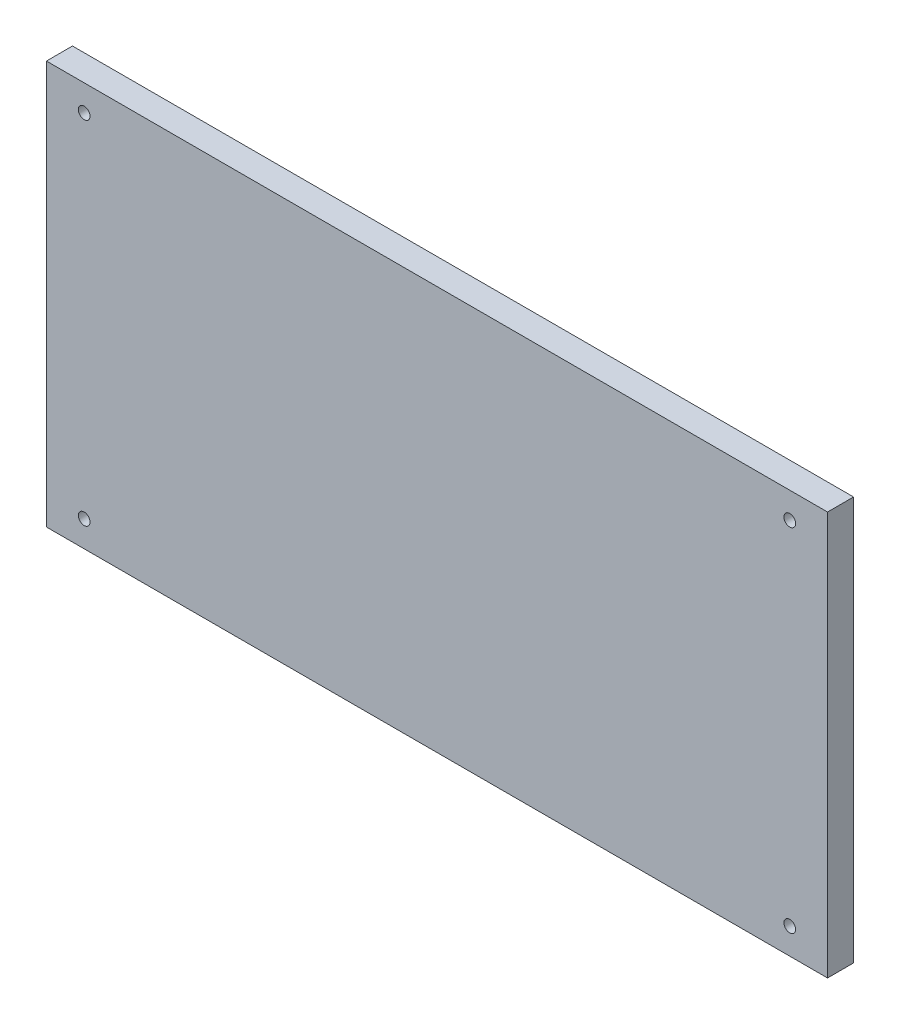
ISO-10303-21;
HEADER;
FILE_DESCRIPTION(('STEP AP214'),'2;1');
FILE_NAME('part.step','',(''),(''),'','','');
FILE_SCHEMA(('AUTOMOTIVE_DESIGN { 1 0 10303 214 1 1 1 1 }'));
ENDSEC;
DATA;
#1=APPLICATION_CONTEXT('core data for automotive mechanical design processes');
#2=APPLICATION_PROTOCOL_DEFINITION('international standard','automotive_design',2000,#1);
#3=PRODUCT_CONTEXT('',#1,'mechanical');
#4=PRODUCT('Part','Part','',(#3));
#5=PRODUCT_RELATED_PRODUCT_CATEGORY('part','',(#4));
#6=PRODUCT_DEFINITION_FORMATION('','',#4);
#7=PRODUCT_DEFINITION_CONTEXT('part definition',#1,'design');
#8=PRODUCT_DEFINITION('design','',#6,#7);
#9=PRODUCT_DEFINITION_SHAPE('','',#8);
#10=(LENGTH_UNIT() NAMED_UNIT(*) SI_UNIT(.MILLI.,.METRE.));
#11=(NAMED_UNIT(*) PLANE_ANGLE_UNIT() SI_UNIT($,.RADIAN.));
#12=(NAMED_UNIT(*) SI_UNIT($,.STERADIAN.) SOLID_ANGLE_UNIT());
#13=UNCERTAINTY_MEASURE_WITH_UNIT(LENGTH_MEASURE(1.E-05),#10,'distance_accuracy_value','');
#14=(GEOMETRIC_REPRESENTATION_CONTEXT(3) GLOBAL_UNCERTAINTY_ASSIGNED_CONTEXT((#13)) GLOBAL_UNIT_ASSIGNED_CONTEXT((#10,
#11,#12)) REPRESENTATION_CONTEXT('',''));
#15=CARTESIAN_POINT('',(0.,0.,0.));
#16=DIRECTION('',(0.,0.,1.));
#17=DIRECTION('',(1.,0.,0.));
#18=AXIS2_PLACEMENT_3D('',#15,#16,#17);
#19=CARTESIAN_POINT('',(-122.444571469039,41.9354838709677,10.));
#20=DIRECTION('',(1.,0.,0.));
#21=DIRECTION('',(0.,1.,0.));
#22=AXIS2_PLACEMENT_3D('',#19,#20,#21);
#23=PLANE('',#22);
#24=DIRECTION('',(0.,-1.,0.));
#25=VECTOR('',#24,1.);
#26=CARTESIAN_POINT('',(-122.444571469039,41.9354838709677,0.));
#27=LINE('',#26,#25);
#28=CARTESIAN_POINT('',(-122.444571469039,41.9354838709677,0.));
#29=VERTEX_POINT('',#28);
#30=CARTESIAN_POINT('',(-122.444571469039,-113.064516129032,0.));
#31=VERTEX_POINT('',#30);
#32=EDGE_CURVE('E106',#29,#31,#27,.T.);
#33=ORIENTED_EDGE('',*,*,#32,.T.);
#34=DIRECTION('',(0.,0.,-1.));
#35=VECTOR('',#34,1.);
#36=CARTESIAN_POINT('',(-122.444571469039,-113.064516129032,10.));
#37=LINE('',#36,#35);
#38=CARTESIAN_POINT('',(-122.444571469039,-113.064516129032,10.));
#39=VERTEX_POINT('',#38);
#40=EDGE_CURVE('E11',#39,#31,#37,.T.);
#41=ORIENTED_EDGE('',*,*,#40,.F.);
#42=DIRECTION('',(0.,-1.,0.));
#43=VECTOR('',#42,1.);
#44=CARTESIAN_POINT('',(-122.444571469039,41.9354838709677,10.));
#45=LINE('',#44,#43);
#46=CARTESIAN_POINT('',(-122.444571469039,41.9354838709677,10.));
#47=VERTEX_POINT('',#46);
#48=EDGE_CURVE('E90',#47,#39,#45,.T.);
#49=ORIENTED_EDGE('',*,*,#48,.F.);
#50=DIRECTION('',(0.,0.,-1.));
#51=VECTOR('',#50,1.);
#52=CARTESIAN_POINT('',(-122.444571469039,41.9354838709677,10.));
#53=LINE('',#52,#51);
#54=EDGE_CURVE('E102',#47,#29,#53,.T.);
#55=ORIENTED_EDGE('',*,*,#54,.T.);
#56=EDGE_LOOP('',(#33,#41,#49,#55));
#57=FACE_BOUND('',#56,.T.);
#58=ADVANCED_FACE('F38',(#57),#23,.F.);
#59=CARTESIAN_POINT('',(-122.444571469039,-113.064516129032,10.));
#60=DIRECTION('',(0.,1.,0.));
#61=DIRECTION('',(0.,0.,1.));
#62=AXIS2_PLACEMENT_3D('',#59,#60,#61);
#63=PLANE('',#62);
#64=DIRECTION('',(1.,0.,0.));
#65=VECTOR('',#64,1.);
#66=CARTESIAN_POINT('',(-122.444571469039,-113.064516129032,0.));
#67=LINE('',#66,#65);
#68=CARTESIAN_POINT('',(177.555428530961,-113.064516129032,0.));
#69=VERTEX_POINT('',#68);
#70=EDGE_CURVE('E95',#31,#69,#67,.T.);
#71=ORIENTED_EDGE('',*,*,#70,.T.);
#72=DIRECTION('',(0.,0.,-1.));
#73=VECTOR('',#72,1.);
#74=CARTESIAN_POINT('',(177.555428530961,-113.064516129032,10.));
#75=LINE('',#74,#73);
#76=CARTESIAN_POINT('',(177.555428530961,-113.064516129032,10.));
#77=VERTEX_POINT('',#76);
#78=EDGE_CURVE('E47',#77,#69,#75,.T.);
#79=ORIENTED_EDGE('',*,*,#78,.F.);
#80=DIRECTION('',(1.,0.,0.));
#81=VECTOR('',#80,1.);
#82=CARTESIAN_POINT('',(-122.444571469039,-113.064516129032,10.));
#83=LINE('',#82,#81);
#84=EDGE_CURVE('E85',#39,#77,#83,.T.);
#85=ORIENTED_EDGE('',*,*,#84,.F.);
#86=ORIENTED_EDGE('',*,*,#40,.T.);
#87=EDGE_LOOP('',(#71,#79,#85,#86));
#88=FACE_BOUND('',#87,.T.);
#89=ADVANCED_FACE('F94',(#88),#63,.F.);
#90=CARTESIAN_POINT('',(177.555428530961,41.9354838709677,10.));
#91=DIRECTION('',(-1.,0.,0.));
#92=DIRECTION('',(0.,-1.,0.));
#93=AXIS2_PLACEMENT_3D('',#90,#91,#92);
#94=PLANE('',#93);
#95=DIRECTION('',(0.,1.,0.));
#96=VECTOR('',#95,1.);
#97=CARTESIAN_POINT('',(177.555428530961,41.9354838709677,0.));
#98=LINE('',#97,#96);
#99=CARTESIAN_POINT('',(177.555428530961,41.9354838709677,0.));
#100=VERTEX_POINT('',#99);
#101=EDGE_CURVE('E72',#69,#100,#98,.T.);
#102=ORIENTED_EDGE('',*,*,#101,.T.);
#103=DIRECTION('',(0.,0.,-1.));
#104=VECTOR('',#103,1.);
#105=CARTESIAN_POINT('',(177.555428530961,41.9354838709677,10.));
#106=LINE('',#105,#104);
#107=CARTESIAN_POINT('',(177.555428530961,41.9354838709677,10.));
#108=VERTEX_POINT('',#107);
#109=EDGE_CURVE('E97',#108,#100,#106,.T.);
#110=ORIENTED_EDGE('',*,*,#109,.F.);
#111=DIRECTION('',(0.,1.,0.));
#112=VECTOR('',#111,1.);
#113=CARTESIAN_POINT('',(177.555428530961,41.9354838709677,10.));
#114=LINE('',#113,#112);
#115=EDGE_CURVE('E88',#77,#108,#114,.T.);
#116=ORIENTED_EDGE('',*,*,#115,.F.);
#117=ORIENTED_EDGE('',*,*,#78,.T.);
#118=EDGE_LOOP('',(#102,#110,#116,#117));
#119=FACE_BOUND('',#118,.T.);
#120=ADVANCED_FACE('F98',(#119),#94,.F.);
#121=CARTESIAN_POINT('',(-122.444571469039,41.9354838709677,10.));
#122=DIRECTION('',(0.,-1.,0.));
#123=DIRECTION('',(0.,0.,-1.));
#124=AXIS2_PLACEMENT_3D('',#121,#122,#123);
#125=PLANE('',#124);
#126=DIRECTION('',(-1.,0.,0.));
#127=VECTOR('',#126,1.);
#128=CARTESIAN_POINT('',(-122.444571469039,41.9354838709677,0.));
#129=LINE('',#128,#127);
#130=EDGE_CURVE('E78',#100,#29,#129,.T.);
#131=ORIENTED_EDGE('',*,*,#130,.T.);
#132=ORIENTED_EDGE('',*,*,#54,.F.);
#133=DIRECTION('',(-1.,0.,0.));
#134=VECTOR('',#133,1.);
#135=CARTESIAN_POINT('',(-122.444571469039,41.9354838709677,10.));
#136=LINE('',#135,#134);
#137=EDGE_CURVE('E55',#108,#47,#136,.T.);
#138=ORIENTED_EDGE('',*,*,#137,.F.);
#139=ORIENTED_EDGE('',*,*,#109,.T.);
#140=EDGE_LOOP('',(#131,#132,#138,#139));
#141=FACE_BOUND('',#140,.T.);
#142=ADVANCED_FACE('F120',(#141),#125,.F.);
#143=CARTESIAN_POINT('',(0.,0.,10.));
#144=DIRECTION('',(0.,0.,1.));
#145=DIRECTION('',(1.,0.,0.));
#146=AXIS2_PLACEMENT_3D('',#143,#144,#145);
#147=PLANE('',#146);
#148=CARTESIAN_POINT('',(-107.944571469039,-103.064516129032,10.));
#149=DIRECTION('',(0.,0.,-1.));
#150=DIRECTION('',(-1.,0.,0.));
#151=AXIS2_PLACEMENT_3D('',#148,#149,#150);
#152=CIRCLE('',#151,2.25);
#153=CARTESIAN_POINT('',(-110.194571469039,-103.064516129032,10.));
#154=VERTEX_POINT('',#153);
#155=EDGE_CURVE('E139',#154,#154,#152,.T.);
#156=ORIENTED_EDGE('',*,*,#155,.T.);
#157=EDGE_LOOP('',(#156));
#158=FACE_BOUND('',#157,.T.);
#159=CARTESIAN_POINT('',(-107.944571469039,31.9354838709677,10.));
#160=DIRECTION('',(0.,0.,-1.));
#161=DIRECTION('',(-1.,0.,0.));
#162=AXIS2_PLACEMENT_3D('',#159,#160,#161);
#163=CIRCLE('',#162,2.25);
#164=CARTESIAN_POINT('',(-110.194571469039,31.9354838709677,10.));
#165=VERTEX_POINT('',#164);
#166=EDGE_CURVE('E147',#165,#165,#163,.T.);
#167=ORIENTED_EDGE('',*,*,#166,.T.);
#168=EDGE_LOOP('',(#167));
#169=FACE_BOUND('',#168,.T.);
#170=CARTESIAN_POINT('',(163.055428530961,31.9354838709678,10.));
#171=DIRECTION('',(0.,0.,-1.));
#172=DIRECTION('',(-1.,0.,0.));
#173=AXIS2_PLACEMENT_3D('',#170,#171,#172);
#174=CIRCLE('',#173,2.25000000000001);
#175=CARTESIAN_POINT('',(160.805428530961,31.9354838709678,10.));
#176=VERTEX_POINT('',#175);
#177=EDGE_CURVE('E131',#176,#176,#174,.T.);
#178=ORIENTED_EDGE('',*,*,#177,.T.);
#179=EDGE_LOOP('',(#178));
#180=FACE_BOUND('',#179,.T.);
#181=CARTESIAN_POINT('',(163.055428530961,-103.064516129032,10.));
#182=DIRECTION('',(0.,0.,-1.));
#183=DIRECTION('',(-1.,0.,0.));
#184=AXIS2_PLACEMENT_3D('',#181,#182,#183);
#185=CIRCLE('',#184,2.25000000000001);
#186=CARTESIAN_POINT('',(160.805428530961,-103.064516129032,10.));
#187=VERTEX_POINT('',#186);
#188=EDGE_CURVE('E110',#187,#187,#185,.T.);
#189=ORIENTED_EDGE('',*,*,#188,.T.);
#190=EDGE_LOOP('',(#189));
#191=FACE_BOUND('',#190,.T.);
#192=ORIENTED_EDGE('',*,*,#48,.T.);
#193=ORIENTED_EDGE('',*,*,#84,.T.);
#194=ORIENTED_EDGE('',*,*,#115,.T.);
#195=ORIENTED_EDGE('',*,*,#137,.T.);
#196=EDGE_LOOP('',(#192,#193,#194,#195));
#197=FACE_BOUND('',#196,.T.);
#198=ADVANCED_FACE('F86',(#158,#169,#180,#191,#197),#147,.T.);
#199=CARTESIAN_POINT('',(0.,0.,0.));
#200=DIRECTION('',(0.,0.,1.));
#201=DIRECTION('',(1.,0.,0.));
#202=AXIS2_PLACEMENT_3D('',#199,#200,#201);
#203=PLANE('',#202);
#204=CARTESIAN_POINT('',(-107.944571469039,-103.064516129032,0.));
#205=DIRECTION('',(0.,0.,-1.));
#206=DIRECTION('',(-1.,0.,0.));
#207=AXIS2_PLACEMENT_3D('',#204,#205,#206);
#208=CIRCLE('',#207,2.25);
#209=CARTESIAN_POINT('',(-110.194571469039,-103.064516129032,0.));
#210=VERTEX_POINT('',#209);
#211=EDGE_CURVE('E135',#210,#210,#208,.T.);
#212=ORIENTED_EDGE('',*,*,#211,.F.);
#213=EDGE_LOOP('',(#212));
#214=FACE_BOUND('',#213,.T.);
#215=CARTESIAN_POINT('',(-107.944571469039,31.9354838709677,0.));
#216=DIRECTION('',(0.,0.,-1.));
#217=DIRECTION('',(-1.,0.,0.));
#218=AXIS2_PLACEMENT_3D('',#215,#216,#217);
#219=CIRCLE('',#218,2.25);
#220=CARTESIAN_POINT('',(-110.194571469039,31.9354838709677,0.));
#221=VERTEX_POINT('',#220);
#222=EDGE_CURVE('E143',#221,#221,#219,.T.);
#223=ORIENTED_EDGE('',*,*,#222,.F.);
#224=EDGE_LOOP('',(#223));
#225=FACE_BOUND('',#224,.T.);
#226=CARTESIAN_POINT('',(163.055428530961,31.9354838709678,0.));
#227=DIRECTION('',(0.,0.,-1.));
#228=DIRECTION('',(-1.,0.,0.));
#229=AXIS2_PLACEMENT_3D('',#226,#227,#228);
#230=CIRCLE('',#229,2.25000000000001);
#231=CARTESIAN_POINT('',(160.805428530961,31.9354838709678,0.));
#232=VERTEX_POINT('',#231);
#233=EDGE_CURVE('E151',#232,#232,#230,.T.);
#234=ORIENTED_EDGE('',*,*,#233,.F.);
#235=EDGE_LOOP('',(#234));
#236=FACE_BOUND('',#235,.T.);
#237=CARTESIAN_POINT('',(163.055428530961,-103.064516129032,0.));
#238=DIRECTION('',(0.,0.,-1.));
#239=DIRECTION('',(-1.,0.,0.));
#240=AXIS2_PLACEMENT_3D('',#237,#238,#239);
#241=CIRCLE('',#240,2.25000000000001);
#242=CARTESIAN_POINT('',(160.805428530961,-103.064516129032,0.));
#243=VERTEX_POINT('',#242);
#244=EDGE_CURVE('E127',#243,#243,#241,.T.);
#245=ORIENTED_EDGE('',*,*,#244,.F.);
#246=EDGE_LOOP('',(#245));
#247=FACE_BOUND('',#246,.T.);
#248=ORIENTED_EDGE('',*,*,#32,.F.);
#249=ORIENTED_EDGE('',*,*,#130,.F.);
#250=ORIENTED_EDGE('',*,*,#101,.F.);
#251=ORIENTED_EDGE('',*,*,#70,.F.);
#252=EDGE_LOOP('',(#248,#249,#250,#251));
#253=FACE_BOUND('',#252,.T.);
#254=ADVANCED_FACE('F123',(#214,#225,#236,#247,#253),#203,.F.);
#255=CARTESIAN_POINT('',(163.055428530961,-103.064516129032,10.));
#256=DIRECTION('',(0.,0.,-1.));
#257=DIRECTION('',(-1.,0.,0.));
#258=AXIS2_PLACEMENT_3D('',#255,#256,#257);
#259=CYLINDRICAL_SURFACE('',#258,2.25000000000001);
#260=ORIENTED_EDGE('',*,*,#188,.F.);
#261=EDGE_LOOP('',(#260));
#262=FACE_BOUND('',#261,.T.);
#263=ORIENTED_EDGE('',*,*,#244,.T.);
#264=EDGE_LOOP('',(#263));
#265=FACE_BOUND('',#264,.T.);
#266=ADVANCED_FACE('F165',(#262,#265),#259,.F.);
#267=CARTESIAN_POINT('',(163.055428530961,31.9354838709678,10.));
#268=DIRECTION('',(0.,0.,-1.));
#269=DIRECTION('',(-1.,0.,0.));
#270=AXIS2_PLACEMENT_3D('',#267,#268,#269);
#271=CYLINDRICAL_SURFACE('',#270,2.25000000000001);
#272=ORIENTED_EDGE('',*,*,#177,.F.);
#273=EDGE_LOOP('',(#272));
#274=FACE_BOUND('',#273,.T.);
#275=ORIENTED_EDGE('',*,*,#233,.T.);
#276=EDGE_LOOP('',(#275));
#277=FACE_BOUND('',#276,.T.);
#278=ADVANCED_FACE('F161',(#274,#277),#271,.F.);
#279=CARTESIAN_POINT('',(-107.944571469039,31.9354838709677,10.));
#280=DIRECTION('',(0.,0.,-1.));
#281=DIRECTION('',(-1.,0.,0.));
#282=AXIS2_PLACEMENT_3D('',#279,#280,#281);
#283=CYLINDRICAL_SURFACE('',#282,2.25);
#284=ORIENTED_EDGE('',*,*,#166,.F.);
#285=EDGE_LOOP('',(#284));
#286=FACE_BOUND('',#285,.T.);
#287=ORIENTED_EDGE('',*,*,#222,.T.);
#288=EDGE_LOOP('',(#287));
#289=FACE_BOUND('',#288,.T.);
#290=ADVANCED_FACE('F164',(#286,#289),#283,.F.);
#291=CARTESIAN_POINT('',(-107.944571469039,-103.064516129032,10.));
#292=DIRECTION('',(0.,0.,-1.));
#293=DIRECTION('',(-1.,0.,0.));
#294=AXIS2_PLACEMENT_3D('',#291,#292,#293);
#295=CYLINDRICAL_SURFACE('',#294,2.25);
#296=ORIENTED_EDGE('',*,*,#155,.F.);
#297=EDGE_LOOP('',(#296));
#298=FACE_BOUND('',#297,.T.);
#299=ORIENTED_EDGE('',*,*,#211,.T.);
#300=EDGE_LOOP('',(#299));
#301=FACE_BOUND('',#300,.T.);
#302=ADVANCED_FACE('F205',(#298,#301),#295,.F.);
#303=CLOSED_SHELL('',(#58,#89,#120,#142,#198,#254,#266,#278,#290,#302));
#304=MANIFOLD_SOLID_BREP('B2',#303);
#305=ADVANCED_BREP_SHAPE_REPRESENTATION('',(#18,#304),#14);
#306=SHAPE_DEFINITION_REPRESENTATION(#9,#305);
ENDSEC;
END-ISO-10303-21;
